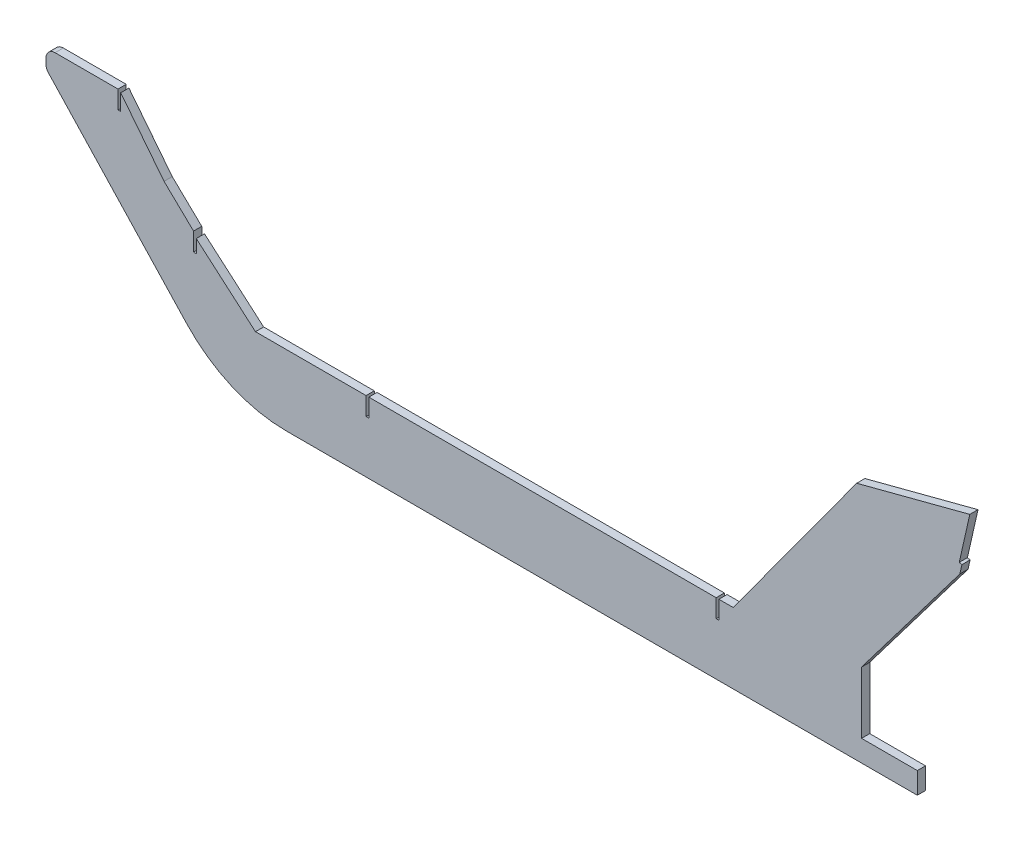
ISO-10303-21;
HEADER;
FILE_DESCRIPTION(('STEP AP214'),'2;1');
FILE_NAME('part.step','',(''),(''),'','','');
FILE_SCHEMA(('AUTOMOTIVE_DESIGN { 1 0 10303 214 1 1 1 1 }'));
ENDSEC;
DATA;
#1=APPLICATION_CONTEXT('core data for automotive mechanical design processes');
#2=APPLICATION_PROTOCOL_DEFINITION('international standard','automotive_design',2000,#1);
#3=PRODUCT_CONTEXT('',#1,'mechanical');
#4=PRODUCT('Part','Part','',(#3));
#5=PRODUCT_RELATED_PRODUCT_CATEGORY('part','',(#4));
#6=PRODUCT_DEFINITION_FORMATION('','',#4);
#7=PRODUCT_DEFINITION_CONTEXT('part definition',#1,'design');
#8=PRODUCT_DEFINITION('design','',#6,#7);
#9=PRODUCT_DEFINITION_SHAPE('','',#8);
#10=(LENGTH_UNIT() NAMED_UNIT(*) SI_UNIT(.MILLI.,.METRE.));
#11=(NAMED_UNIT(*) PLANE_ANGLE_UNIT() SI_UNIT($,.RADIAN.));
#12=(NAMED_UNIT(*) SI_UNIT($,.STERADIAN.) SOLID_ANGLE_UNIT());
#13=UNCERTAINTY_MEASURE_WITH_UNIT(LENGTH_MEASURE(1.E-05),#10,'distance_accuracy_value','');
#14=(GEOMETRIC_REPRESENTATION_CONTEXT(3) GLOBAL_UNCERTAINTY_ASSIGNED_CONTEXT((#13)) GLOBAL_UNIT_ASSIGNED_CONTEXT((#10,
#11,#12)) REPRESENTATION_CONTEXT('',''));
#15=CARTESIAN_POINT('',(0.,0.,0.));
#16=DIRECTION('',(0.,0.,1.));
#17=DIRECTION('',(1.,0.,0.));
#18=AXIS2_PLACEMENT_3D('',#15,#16,#17);
#19=CARTESIAN_POINT('',(0.,23.5441952155164,-4.5));
#20=DIRECTION('',(1.,0.,0.));
#21=DIRECTION('',(0.,0.,-1.));
#22=AXIS2_PLACEMENT_3D('',#19,#20,#21);
#23=PLANE('',#22);
#24=DIRECTION('',(0.,0.,1.));
#25=VECTOR('',#24,1.);
#26=CARTESIAN_POINT('',(0.,23.5441952155164,-4.5));
#27=LINE('',#26,#25);
#28=CARTESIAN_POINT('',(0.,23.5441952155164,-4.5));
#29=VERTEX_POINT('',#28);
#30=CARTESIAN_POINT('',(0.,23.5441952155164,4.5));
#31=VERTEX_POINT('',#30);
#32=EDGE_CURVE('E262',#29,#31,#27,.T.);
#33=ORIENTED_EDGE('',*,*,#32,.T.);
#34=DIRECTION('',(0.,1.,0.));
#35=VECTOR('',#34,1.);
#36=CARTESIAN_POINT('',(0.,23.5441952155164,4.5));
#37=LINE('',#36,#35);
#38=CARTESIAN_POINT('',(0.,0.,4.5));
#39=VERTEX_POINT('',#38);
#40=EDGE_CURVE('E266',#39,#31,#37,.T.);
#41=ORIENTED_EDGE('',*,*,#40,.F.);
#42=DIRECTION('',(0.,0.,1.));
#43=VECTOR('',#42,1.);
#44=CARTESIAN_POINT('',(0.,0.,-4.5));
#45=LINE('',#44,#43);
#46=CARTESIAN_POINT('',(0.,0.,-4.5));
#47=VERTEX_POINT('',#46);
#48=EDGE_CURVE('E457',#47,#39,#45,.T.);
#49=ORIENTED_EDGE('',*,*,#48,.F.);
#50=DIRECTION('',(0.,1.,0.));
#51=VECTOR('',#50,1.);
#52=CARTESIAN_POINT('',(0.,23.5441952155164,-4.5));
#53=LINE('',#52,#51);
#54=EDGE_CURVE('E268',#47,#29,#53,.T.);
#55=ORIENTED_EDGE('',*,*,#54,.T.);
#56=EDGE_LOOP('',(#33,#41,#49,#55));
#57=FACE_BOUND('',#56,.T.);
#58=ADVANCED_FACE('F41',(#57),#23,.T.);
#59=CARTESIAN_POINT('',(0.,0.,-4.5));
#60=DIRECTION('',(0.,-1.,0.));
#61=DIRECTION('',(1.,0.,0.));
#62=AXIS2_PLACEMENT_3D('',#59,#60,#61);
#63=PLANE('',#62);
#64=DIRECTION('',(1.,0.,0.));
#65=VECTOR('',#64,1.);
#66=CARTESIAN_POINT('',(0.,0.,4.5));
#67=LINE('',#66,#65);
#68=CARTESIAN_POINT('',(-693.621415605386,0.,4.5));
#69=VERTEX_POINT('',#68);
#70=EDGE_CURVE('E286',#69,#39,#67,.T.);
#71=ORIENTED_EDGE('',*,*,#70,.F.);
#72=DIRECTION('',(0.,0.,1.));
#73=VECTOR('',#72,1.);
#74=CARTESIAN_POINT('',(-693.621415605386,0.,-4.5));
#75=LINE('',#74,#73);
#76=CARTESIAN_POINT('',(-693.621415605386,0.,-4.5));
#77=VERTEX_POINT('',#76);
#78=EDGE_CURVE('E515',#69,#77,#75,.F.);
#79=ORIENTED_EDGE('',*,*,#78,.T.);
#80=DIRECTION('',(1.,0.,0.));
#81=VECTOR('',#80,1.);
#82=CARTESIAN_POINT('',(0.,0.,-4.5));
#83=LINE('',#82,#81);
#84=EDGE_CURVE('E273',#77,#47,#83,.T.);
#85=ORIENTED_EDGE('',*,*,#84,.T.);
#86=ORIENTED_EDGE('',*,*,#48,.T.);
#87=EDGE_LOOP('',(#71,#79,#85,#86));
#88=FACE_BOUND('',#87,.T.);
#89=ADVANCED_FACE('F556',(#88),#63,.T.);
#90=CARTESIAN_POINT('',(-758.779695033301,0.,-4.5));
#91=DIRECTION('',(-0.73086723876955,-0.682519654876967,0.));
#92=DIRECTION('',(0.682519654876967,-0.73086723876955,0.));
#93=AXIS2_PLACEMENT_3D('',#90,#91,#92);
#94=PLANE('',#93);
#95=DIRECTION('',(0.682519654876967,-0.73086723876955,0.));
#96=VECTOR('',#95,1.);
#97=CARTESIAN_POINT('',(-758.779695033301,0.,4.5));
#98=LINE('',#97,#96);
#99=CARTESIAN_POINT('',(-954.987449898675,210.106506089526,4.5));
#100=VERTEX_POINT('',#99);
#101=CARTESIAN_POINT('',(-803.251501420818,47.6220517684549,4.5));
#102=VERTEX_POINT('',#101);
#103=EDGE_CURVE('E368',#100,#102,#98,.T.);
#104=ORIENTED_EDGE('',*,*,#103,.F.);
#105=DIRECTION('',(0.,0.,1.));
#106=VECTOR('',#105,1.);
#107=CARTESIAN_POINT('',(-954.987449898675,210.106506089526,-4.5));
#108=LINE('',#107,#106);
#109=CARTESIAN_POINT('',(-954.987449898675,210.106506089526,-4.5));
#110=VERTEX_POINT('',#109);
#111=EDGE_CURVE('E11',#100,#110,#108,.F.);
#112=ORIENTED_EDGE('',*,*,#111,.T.);
#113=DIRECTION('',(0.682519654876967,-0.73086723876955,0.));
#114=VECTOR('',#113,1.);
#115=CARTESIAN_POINT('',(-758.779695033301,0.,-4.5));
#116=LINE('',#115,#114);
#117=CARTESIAN_POINT('',(-803.251501420818,47.6220517684549,-4.5));
#118=VERTEX_POINT('',#117);
#119=EDGE_CURVE('E454',#110,#118,#116,.T.);
#120=ORIENTED_EDGE('',*,*,#119,.T.);
#121=DIRECTION('',(0.,0.,1.));
#122=VECTOR('',#121,1.);
#123=CARTESIAN_POINT('',(-803.251501420818,47.6220517684549,-4.5));
#124=LINE('',#123,#122);
#125=EDGE_CURVE('E459',#118,#102,#124,.T.);
#126=ORIENTED_EDGE('',*,*,#125,.T.);
#127=EDGE_LOOP('',(#104,#112,#120,#126));
#128=FACE_BOUND('',#127,.T.);
#129=ADVANCED_FACE('F549',(#128),#94,.T.);
#130=CARTESIAN_POINT('',(-957.67877751098,212.988479035761,-4.5));
#131=DIRECTION('',(-1.,0.,0.));
#132=DIRECTION('',(0.,0.,1.));
#133=AXIS2_PLACEMENT_3D('',#130,#131,#132);
#134=PLANE('',#133);
#135=DIRECTION('',(0.,-1.,0.));
#136=VECTOR('',#135,1.);
#137=CARTESIAN_POINT('',(-957.67877751098,212.988479035761,4.5));
#138=LINE('',#137,#136);
#139=CARTESIAN_POINT('',(-957.67877751098,222.988479035761,4.5));
#140=VERTEX_POINT('',#139);
#141=CARTESIAN_POINT('',(-957.67877751098,216.931702638296,4.5));
#142=VERTEX_POINT('',#141);
#143=EDGE_CURVE('E365',#140,#142,#138,.T.);
#144=ORIENTED_EDGE('',*,*,#143,.F.);
#145=DIRECTION('',(0.,0.,1.));
#146=VECTOR('',#145,1.);
#147=CARTESIAN_POINT('',(-957.67877751098,222.988479035761,-4.5));
#148=LINE('',#147,#146);
#149=CARTESIAN_POINT('',(-957.67877751098,222.988479035761,-4.5));
#150=VERTEX_POINT('',#149);
#151=EDGE_CURVE('E530',#140,#150,#148,.F.);
#152=ORIENTED_EDGE('',*,*,#151,.T.);
#153=DIRECTION('',(0.,-1.,0.));
#154=VECTOR('',#153,1.);
#155=CARTESIAN_POINT('',(-957.67877751098,212.988479035761,-4.5));
#156=LINE('',#155,#154);
#157=CARTESIAN_POINT('',(-957.67877751098,216.931702638296,-4.5));
#158=VERTEX_POINT('',#157);
#159=EDGE_CURVE('E452',#150,#158,#156,.T.);
#160=ORIENTED_EDGE('',*,*,#159,.T.);
#161=DIRECTION('',(0.,0.,1.));
#162=VECTOR('',#161,1.);
#163=CARTESIAN_POINT('',(-957.67877751098,216.931702638296,-4.5));
#164=LINE('',#163,#162);
#165=EDGE_CURVE('E527',#158,#142,#164,.T.);
#166=ORIENTED_EDGE('',*,*,#165,.T.);
#167=EDGE_LOOP('',(#144,#152,#160,#166));
#168=FACE_BOUND('',#167,.T.);
#169=ADVANCED_FACE('F545',(#168),#134,.T.);
#170=CARTESIAN_POINT('',(-957.67877751098,232.988479035761,-4.5));
#171=DIRECTION('',(0.,1.,0.));
#172=DIRECTION('',(0.,0.,1.));
#173=AXIS2_PLACEMENT_3D('',#170,#171,#172);
#174=PLANE('',#173);
#175=DIRECTION('',(-1.,0.,0.));
#176=VECTOR('',#175,1.);
#177=CARTESIAN_POINT('',(-957.67877751098,232.988479035761,-4.5));
#178=LINE('',#177,#176);
#179=CARTESIAN_POINT('',(-878.536330397254,232.988479035761,-4.5));
#180=VERTEX_POINT('',#179);
#181=CARTESIAN_POINT('',(-947.67877751098,232.988479035761,-4.5));
#182=VERTEX_POINT('',#181);
#183=EDGE_CURVE('E449',#180,#182,#178,.T.);
#184=ORIENTED_EDGE('',*,*,#183,.T.);
#185=DIRECTION('',(0.,0.,1.));
#186=VECTOR('',#185,1.);
#187=CARTESIAN_POINT('',(-947.67877751098,232.988479035761,-4.5));
#188=LINE('',#187,#186);
#189=CARTESIAN_POINT('',(-947.67877751098,232.988479035761,4.5));
#190=VERTEX_POINT('',#189);
#191=EDGE_CURVE('E520',#182,#190,#188,.T.);
#192=ORIENTED_EDGE('',*,*,#191,.T.);
#193=DIRECTION('',(-1.,0.,0.));
#194=VECTOR('',#193,1.);
#195=CARTESIAN_POINT('',(-957.67877751098,232.988479035761,4.5));
#196=LINE('',#195,#194);
#197=CARTESIAN_POINT('',(-878.536330397254,232.988479035761,4.5));
#198=VERTEX_POINT('',#197);
#199=EDGE_CURVE('E363',#198,#190,#196,.T.);
#200=ORIENTED_EDGE('',*,*,#199,.F.);
#201=DIRECTION('',(0.,0.,1.));
#202=VECTOR('',#201,1.);
#203=CARTESIAN_POINT('',(-878.536330397254,232.988479035761,-4.5));
#204=LINE('',#203,#202);
#205=EDGE_CURVE('E460',#180,#198,#204,.T.);
#206=ORIENTED_EDGE('',*,*,#205,.F.);
#207=EDGE_LOOP('',(#184,#192,#200,#206));
#208=FACE_BOUND('',#207,.T.);
#209=ADVANCED_FACE('F540',(#208),#174,.T.);
#210=CARTESIAN_POINT('',(-878.536330397254,232.988479035761,-4.5));
#211=DIRECTION('',(1.,0.,0.));
#212=DIRECTION('',(0.,0.,-1.));
#213=AXIS2_PLACEMENT_3D('',#210,#211,#212);
#214=PLANE('',#213);
#215=ORIENTED_EDGE('',*,*,#205,.T.);
#216=DIRECTION('',(0.,1.,0.));
#217=VECTOR('',#216,1.);
#218=CARTESIAN_POINT('',(-878.536330397254,232.988479035761,4.5));
#219=LINE('',#218,#217);
#220=CARTESIAN_POINT('',(-878.536330397254,212.988479035761,4.5));
#221=VERTEX_POINT('',#220);
#222=EDGE_CURVE('E360',#221,#198,#219,.T.);
#223=ORIENTED_EDGE('',*,*,#222,.F.);
#224=DIRECTION('',(0.,0.,1.));
#225=VECTOR('',#224,1.);
#226=CARTESIAN_POINT('',(-878.536330397254,212.988479035761,-4.5));
#227=LINE('',#226,#225);
#228=CARTESIAN_POINT('',(-878.536330397254,212.988479035761,-4.5));
#229=VERTEX_POINT('',#228);
#230=EDGE_CURVE('E462',#229,#221,#227,.T.);
#231=ORIENTED_EDGE('',*,*,#230,.F.);
#232=DIRECTION('',(0.,1.,0.));
#233=VECTOR('',#232,1.);
#234=CARTESIAN_POINT('',(-878.536330397254,232.988479035761,-4.5));
#235=LINE('',#234,#233);
#236=EDGE_CURVE('E446',#229,#180,#235,.T.);
#237=ORIENTED_EDGE('',*,*,#236,.T.);
#238=EDGE_LOOP('',(#215,#223,#231,#237));
#239=FACE_BOUND('',#238,.T.);
#240=ADVANCED_FACE('F654',(#239),#214,.T.);
#241=CARTESIAN_POINT('',(-878.536330397254,212.988479035761,-4.5));
#242=DIRECTION('',(0.,1.,0.));
#243=DIRECTION('',(0.,0.,1.));
#244=AXIS2_PLACEMENT_3D('',#241,#242,#243);
#245=PLANE('',#244);
#246=ORIENTED_EDGE('',*,*,#230,.T.);
#247=DIRECTION('',(-1.,0.,0.));
#248=VECTOR('',#247,1.);
#249=CARTESIAN_POINT('',(-878.536330397254,212.988479035761,4.5));
#250=LINE('',#249,#248);
#251=CARTESIAN_POINT('',(-875.536330397254,212.988479035761,4.5));
#252=VERTEX_POINT('',#251);
#253=EDGE_CURVE('E357',#252,#221,#250,.T.);
#254=ORIENTED_EDGE('',*,*,#253,.F.);
#255=DIRECTION('',(0.,0.,1.));
#256=VECTOR('',#255,1.);
#257=CARTESIAN_POINT('',(-875.536330397254,212.988479035761,-4.5));
#258=LINE('',#257,#256);
#259=CARTESIAN_POINT('',(-875.536330397254,212.988479035761,-4.5));
#260=VERTEX_POINT('',#259);
#261=EDGE_CURVE('E464',#260,#252,#258,.T.);
#262=ORIENTED_EDGE('',*,*,#261,.F.);
#263=DIRECTION('',(-1.,0.,0.));
#264=VECTOR('',#263,1.);
#265=CARTESIAN_POINT('',(-878.536330397254,212.988479035761,-4.5));
#266=LINE('',#265,#264);
#267=EDGE_CURVE('E443',#260,#229,#266,.T.);
#268=ORIENTED_EDGE('',*,*,#267,.T.);
#269=EDGE_LOOP('',(#246,#254,#262,#268));
#270=FACE_BOUND('',#269,.T.);
#271=ADVANCED_FACE('F652',(#270),#245,.T.);
#272=CARTESIAN_POINT('',(-875.536330397254,212.988479035761,-4.5));
#273=DIRECTION('',(-1.,0.,0.));
#274=DIRECTION('',(0.,0.,1.));
#275=AXIS2_PLACEMENT_3D('',#272,#273,#274);
#276=PLANE('',#275);
#277=ORIENTED_EDGE('',*,*,#261,.T.);
#278=DIRECTION('',(0.,-1.,0.));
#279=VECTOR('',#278,1.);
#280=CARTESIAN_POINT('',(-875.536330397254,212.988479035761,4.5));
#281=LINE('',#280,#279);
#282=CARTESIAN_POINT('',(-875.536330397254,230.940110876433,4.5));
#283=VERTEX_POINT('',#282);
#284=EDGE_CURVE('E354',#283,#252,#281,.T.);
#285=ORIENTED_EDGE('',*,*,#284,.F.);
#286=DIRECTION('',(0.,0.,1.));
#287=VECTOR('',#286,1.);
#288=CARTESIAN_POINT('',(-875.536330397254,230.940110876433,-4.5));
#289=LINE('',#288,#287);
#290=CARTESIAN_POINT('',(-875.536330397254,230.940110876433,-4.5));
#291=VERTEX_POINT('',#290);
#292=EDGE_CURVE('E466',#291,#283,#289,.T.);
#293=ORIENTED_EDGE('',*,*,#292,.F.);
#294=DIRECTION('',(0.,-1.,0.));
#295=VECTOR('',#294,1.);
#296=CARTESIAN_POINT('',(-875.536330397254,212.988479035761,-4.5));
#297=LINE('',#296,#295);
#298=EDGE_CURVE('E440',#291,#260,#297,.T.);
#299=ORIENTED_EDGE('',*,*,#298,.T.);
#300=EDGE_LOOP('',(#277,#285,#293,#299));
#301=FACE_BOUND('',#300,.T.);
#302=ADVANCED_FACE('F650',(#301),#276,.T.);
#303=CARTESIAN_POINT('',(-875.536330397254,230.940110876433,-4.5));
#304=DIRECTION('',(0.785943303801176,0.618298571250244,0.));
#305=DIRECTION('',(-0.618298571250244,0.785943303801176,0.));
#306=AXIS2_PLACEMENT_3D('',#303,#304,#305);
#307=PLANE('',#306);
#308=ORIENTED_EDGE('',*,*,#292,.T.);
#309=DIRECTION('',(-0.618298571250244,0.785943303801176,0.));
#310=VECTOR('',#309,1.);
#311=CARTESIAN_POINT('',(-875.536330397254,230.940110876433,4.5));
#312=LINE('',#311,#310);
#313=CARTESIAN_POINT('',(-827.92820437735,170.423574704911,4.5));
#314=VERTEX_POINT('',#313);
#315=EDGE_CURVE('E351',#314,#283,#312,.T.);
#316=ORIENTED_EDGE('',*,*,#315,.F.);
#317=DIRECTION('',(0.,0.,1.));
#318=VECTOR('',#317,1.);
#319=CARTESIAN_POINT('',(-827.92820437735,170.423574704911,-4.5));
#320=LINE('',#319,#318);
#321=CARTESIAN_POINT('',(-827.92820437735,170.423574704911,-4.5));
#322=VERTEX_POINT('',#321);
#323=EDGE_CURVE('E468',#322,#314,#320,.T.);
#324=ORIENTED_EDGE('',*,*,#323,.F.);
#325=DIRECTION('',(-0.618298571250244,0.785943303801176,0.));
#326=VECTOR('',#325,1.);
#327=CARTESIAN_POINT('',(-875.536330397254,230.940110876433,-4.5));
#328=LINE('',#327,#326);
#329=EDGE_CURVE('E437',#322,#291,#328,.T.);
#330=ORIENTED_EDGE('',*,*,#329,.T.);
#331=EDGE_LOOP('',(#308,#316,#324,#330));
#332=FACE_BOUND('',#331,.T.);
#333=ADVANCED_FACE('F645',(#332),#307,.T.);
#334=CARTESIAN_POINT('',(-827.92820437735,170.423574704911,-4.5));
#335=DIRECTION('',(0.692207582207109,0.721698457207017,0.));
#336=DIRECTION('',(-0.721698457207017,0.692207582207109,0.));
#337=AXIS2_PLACEMENT_3D('',#334,#335,#336);
#338=PLANE('',#337);
#339=ORIENTED_EDGE('',*,*,#323,.T.);
#340=DIRECTION('',(-0.721698457207017,0.692207582207109,0.));
#341=VECTOR('',#340,1.);
#342=CARTESIAN_POINT('',(-827.92820437735,170.423574704911,4.5));
#343=LINE('',#342,#341);
#344=CARTESIAN_POINT('',(-795.486560580996,139.307598786097,4.5));
#345=VERTEX_POINT('',#344);
#346=EDGE_CURVE('E348',#345,#314,#343,.T.);
#347=ORIENTED_EDGE('',*,*,#346,.F.);
#348=DIRECTION('',(0.,0.,1.));
#349=VECTOR('',#348,1.);
#350=CARTESIAN_POINT('',(-795.486560580996,139.307598786097,-4.5));
#351=LINE('',#350,#349);
#352=CARTESIAN_POINT('',(-795.486560580996,139.307598786097,-4.5));
#353=VERTEX_POINT('',#352);
#354=EDGE_CURVE('E470',#353,#345,#351,.T.);
#355=ORIENTED_EDGE('',*,*,#354,.F.);
#356=DIRECTION('',(-0.721698457207017,0.692207582207109,0.));
#357=VECTOR('',#356,1.);
#358=CARTESIAN_POINT('',(-827.92820437735,170.423574704911,-4.5));
#359=LINE('',#358,#357);
#360=EDGE_CURVE('E434',#353,#322,#359,.T.);
#361=ORIENTED_EDGE('',*,*,#360,.T.);
#362=EDGE_LOOP('',(#339,#347,#355,#361));
#363=FACE_BOUND('',#362,.T.);
#364=ADVANCED_FACE('F640',(#363),#338,.T.);
#365=CARTESIAN_POINT('',(-795.486560580996,139.307598786097,-4.5));
#366=DIRECTION('',(1.,0.,0.));
#367=DIRECTION('',(0.,0.,-1.));
#368=AXIS2_PLACEMENT_3D('',#365,#366,#367);
#369=PLANE('',#368);
#370=ORIENTED_EDGE('',*,*,#354,.T.);
#371=DIRECTION('',(0.,1.,0.));
#372=VECTOR('',#371,1.);
#373=CARTESIAN_POINT('',(-795.486560580996,139.307598786097,4.5));
#374=LINE('',#373,#372);
#375=CARTESIAN_POINT('',(-795.486560580996,119.307598786098,4.5));
#376=VERTEX_POINT('',#375);
#377=EDGE_CURVE('E345',#376,#345,#374,.T.);
#378=ORIENTED_EDGE('',*,*,#377,.F.);
#379=DIRECTION('',(0.,0.,1.));
#380=VECTOR('',#379,1.);
#381=CARTESIAN_POINT('',(-795.486560580996,119.307598786098,-4.5));
#382=LINE('',#381,#380);
#383=CARTESIAN_POINT('',(-795.486560580996,119.307598786098,-4.5));
#384=VERTEX_POINT('',#383);
#385=EDGE_CURVE('E472',#384,#376,#382,.T.);
#386=ORIENTED_EDGE('',*,*,#385,.F.);
#387=DIRECTION('',(0.,1.,0.));
#388=VECTOR('',#387,1.);
#389=CARTESIAN_POINT('',(-795.486560580996,139.307598786097,-4.5));
#390=LINE('',#389,#388);
#391=EDGE_CURVE('E431',#384,#353,#390,.T.);
#392=ORIENTED_EDGE('',*,*,#391,.T.);
#393=EDGE_LOOP('',(#370,#378,#386,#392));
#394=FACE_BOUND('',#393,.T.);
#395=ADVANCED_FACE('F638',(#394),#369,.T.);
#396=CARTESIAN_POINT('',(-795.486560580996,119.307598786098,-4.5));
#397=DIRECTION('',(0.,1.,0.));
#398=DIRECTION('',(0.,0.,1.));
#399=AXIS2_PLACEMENT_3D('',#396,#397,#398);
#400=PLANE('',#399);
#401=ORIENTED_EDGE('',*,*,#385,.T.);
#402=DIRECTION('',(-1.,0.,0.));
#403=VECTOR('',#402,1.);
#404=CARTESIAN_POINT('',(-795.486560580996,119.307598786098,4.5));
#405=LINE('',#404,#403);
#406=CARTESIAN_POINT('',(-792.486560580996,119.307598786098,4.5));
#407=VERTEX_POINT('',#406);
#408=EDGE_CURVE('E342',#407,#376,#405,.T.);
#409=ORIENTED_EDGE('',*,*,#408,.F.);
#410=DIRECTION('',(0.,0.,1.));
#411=VECTOR('',#410,1.);
#412=CARTESIAN_POINT('',(-792.486560580996,119.307598786098,-4.5));
#413=LINE('',#412,#411);
#414=CARTESIAN_POINT('',(-792.486560580996,119.307598786098,-4.5));
#415=VERTEX_POINT('',#414);
#416=EDGE_CURVE('E474',#415,#407,#413,.T.);
#417=ORIENTED_EDGE('',*,*,#416,.F.);
#418=DIRECTION('',(-1.,0.,0.));
#419=VECTOR('',#418,1.);
#420=CARTESIAN_POINT('',(-795.486560580996,119.307598786098,-4.5));
#421=LINE('',#420,#419);
#422=EDGE_CURVE('E428',#415,#384,#421,.T.);
#423=ORIENTED_EDGE('',*,*,#422,.T.);
#424=EDGE_LOOP('',(#401,#409,#417,#423));
#425=FACE_BOUND('',#424,.T.);
#426=ADVANCED_FACE('F633',(#425),#400,.T.);
#427=CARTESIAN_POINT('',(-792.486560580996,119.307598786098,-4.5));
#428=DIRECTION('',(-1.,0.,0.));
#429=DIRECTION('',(0.,0.,1.));
#430=AXIS2_PLACEMENT_3D('',#427,#428,#429);
#431=PLANE('',#430);
#432=ORIENTED_EDGE('',*,*,#416,.T.);
#433=DIRECTION('',(0.,-1.,0.));
#434=VECTOR('',#433,1.);
#435=CARTESIAN_POINT('',(-792.486560580996,119.307598786098,4.5));
#436=LINE('',#435,#434);
#437=CARTESIAN_POINT('',(-792.486560580996,133.699221333963,4.5));
#438=VERTEX_POINT('',#437);
#439=EDGE_CURVE('E339',#438,#407,#436,.T.);
#440=ORIENTED_EDGE('',*,*,#439,.F.);
#441=DIRECTION('',(0.,0.,1.));
#442=VECTOR('',#441,1.);
#443=CARTESIAN_POINT('',(-792.486560580996,133.699221333963,-4.5));
#444=LINE('',#443,#442);
#445=CARTESIAN_POINT('',(-792.486560580996,133.699221333963,-4.5));
#446=VERTEX_POINT('',#445);
#447=EDGE_CURVE('E476',#446,#438,#444,.T.);
#448=ORIENTED_EDGE('',*,*,#447,.F.);
#449=DIRECTION('',(0.,-1.,0.));
#450=VECTOR('',#449,1.);
#451=CARTESIAN_POINT('',(-792.486560580996,119.307598786098,-4.5));
#452=LINE('',#451,#450);
#453=EDGE_CURVE('E425',#446,#415,#452,.T.);
#454=ORIENTED_EDGE('',*,*,#453,.T.);
#455=EDGE_LOOP('',(#432,#440,#448,#454));
#456=FACE_BOUND('',#455,.T.);
#457=ADVANCED_FACE('F628',(#456),#431,.T.);
#458=CARTESIAN_POINT('',(-792.486560580996,133.699221333963,-4.5));
#459=DIRECTION('',(0.653632356666354,0.756812223949104,0.));
#460=DIRECTION('',(-0.756812223949104,0.653632356666354,0.));
#461=AXIS2_PLACEMENT_3D('',#458,#459,#460);
#462=PLANE('',#461);
#463=ORIENTED_EDGE('',*,*,#447,.T.);
#464=DIRECTION('',(-0.756812223949104,0.653632356666354,0.));
#465=VECTOR('',#464,1.);
#466=CARTESIAN_POINT('',(-792.486560580996,133.699221333963,4.5));
#467=LINE('',#466,#465);
#468=CARTESIAN_POINT('',(-727.464635298531,77.542049300469,4.5));
#469=VERTEX_POINT('',#468);
#470=EDGE_CURVE('E336',#469,#438,#467,.T.);
#471=ORIENTED_EDGE('',*,*,#470,.F.);
#472=DIRECTION('',(0.,0.,1.));
#473=VECTOR('',#472,1.);
#474=CARTESIAN_POINT('',(-727.464635298531,77.542049300469,-4.5));
#475=LINE('',#474,#473);
#476=CARTESIAN_POINT('',(-727.464635298531,77.542049300469,-4.5));
#477=VERTEX_POINT('',#476);
#478=EDGE_CURVE('E478',#477,#469,#475,.T.);
#479=ORIENTED_EDGE('',*,*,#478,.F.);
#480=DIRECTION('',(-0.756812223949104,0.653632356666354,0.));
#481=VECTOR('',#480,1.);
#482=CARTESIAN_POINT('',(-792.486560580996,133.699221333963,-4.5));
#483=LINE('',#482,#481);
#484=EDGE_CURVE('E422',#477,#446,#483,.T.);
#485=ORIENTED_EDGE('',*,*,#484,.T.);
#486=EDGE_LOOP('',(#463,#471,#479,#485));
#487=FACE_BOUND('',#486,.T.);
#488=ADVANCED_FACE('F626',(#487),#462,.T.);
#489=CARTESIAN_POINT('',(-727.464635298531,77.542049300469,-4.5));
#490=DIRECTION('',(0.,1.,0.));
#491=DIRECTION('',(0.,0.,1.));
#492=AXIS2_PLACEMENT_3D('',#489,#490,#491);
#493=PLANE('',#492);
#494=ORIENTED_EDGE('',*,*,#478,.T.);
#495=DIRECTION('',(-1.,0.,0.));
#496=VECTOR('',#495,1.);
#497=CARTESIAN_POINT('',(-727.464635298531,77.542049300469,4.5));
#498=LINE('',#497,#496);
#499=CARTESIAN_POINT('',(-605.872801012454,77.542049300469,4.5));
#500=VERTEX_POINT('',#499);
#501=EDGE_CURVE('E333',#500,#469,#498,.T.);
#502=ORIENTED_EDGE('',*,*,#501,.F.);
#503=DIRECTION('',(0.,0.,1.));
#504=VECTOR('',#503,1.);
#505=CARTESIAN_POINT('',(-605.872801012454,77.542049300469,-4.5));
#506=LINE('',#505,#504);
#507=CARTESIAN_POINT('',(-605.872801012454,77.542049300469,-4.5));
#508=VERTEX_POINT('',#507);
#509=EDGE_CURVE('E480',#508,#500,#506,.T.);
#510=ORIENTED_EDGE('',*,*,#509,.F.);
#511=DIRECTION('',(-1.,0.,0.));
#512=VECTOR('',#511,1.);
#513=CARTESIAN_POINT('',(-727.464635298531,77.542049300469,-4.5));
#514=LINE('',#513,#512);
#515=EDGE_CURVE('E419',#508,#477,#514,.T.);
#516=ORIENTED_EDGE('',*,*,#515,.T.);
#517=EDGE_LOOP('',(#494,#502,#510,#516));
#518=FACE_BOUND('',#517,.T.);
#519=ADVANCED_FACE('F621',(#518),#493,.T.);
#520=CARTESIAN_POINT('',(-605.872801012454,77.542049300469,-4.5));
#521=DIRECTION('',(1.,0.,0.));
#522=DIRECTION('',(0.,0.,-1.));
#523=AXIS2_PLACEMENT_3D('',#520,#521,#522);
#524=PLANE('',#523);
#525=ORIENTED_EDGE('',*,*,#509,.T.);
#526=DIRECTION('',(0.,1.,0.));
#527=VECTOR('',#526,1.);
#528=CARTESIAN_POINT('',(-605.872801012454,77.542049300469,4.5));
#529=LINE('',#528,#527);
#530=CARTESIAN_POINT('',(-605.872801012454,57.542049300469,4.5));
#531=VERTEX_POINT('',#530);
#532=EDGE_CURVE('E330',#531,#500,#529,.T.);
#533=ORIENTED_EDGE('',*,*,#532,.F.);
#534=DIRECTION('',(0.,0.,1.));
#535=VECTOR('',#534,1.);
#536=CARTESIAN_POINT('',(-605.872801012454,57.542049300469,-4.5));
#537=LINE('',#536,#535);
#538=CARTESIAN_POINT('',(-605.872801012454,57.542049300469,-4.5));
#539=VERTEX_POINT('',#538);
#540=EDGE_CURVE('E482',#539,#531,#537,.T.);
#541=ORIENTED_EDGE('',*,*,#540,.F.);
#542=DIRECTION('',(0.,1.,0.));
#543=VECTOR('',#542,1.);
#544=CARTESIAN_POINT('',(-605.872801012454,77.542049300469,-4.5));
#545=LINE('',#544,#543);
#546=EDGE_CURVE('E416',#539,#508,#545,.T.);
#547=ORIENTED_EDGE('',*,*,#546,.T.);
#548=EDGE_LOOP('',(#525,#533,#541,#547));
#549=FACE_BOUND('',#548,.T.);
#550=ADVANCED_FACE('F616',(#549),#524,.T.);
#551=CARTESIAN_POINT('',(-605.872801012454,57.542049300469,-4.5));
#552=DIRECTION('',(0.,1.,0.));
#553=DIRECTION('',(0.,0.,1.));
#554=AXIS2_PLACEMENT_3D('',#551,#552,#553);
#555=PLANE('',#554);
#556=ORIENTED_EDGE('',*,*,#540,.T.);
#557=DIRECTION('',(-1.,0.,0.));
#558=VECTOR('',#557,1.);
#559=CARTESIAN_POINT('',(-605.872801012454,57.542049300469,4.5));
#560=LINE('',#559,#558);
#561=CARTESIAN_POINT('',(-602.872801012454,57.542049300469,4.5));
#562=VERTEX_POINT('',#561);
#563=EDGE_CURVE('E327',#562,#531,#560,.T.);
#564=ORIENTED_EDGE('',*,*,#563,.F.);
#565=DIRECTION('',(0.,0.,1.));
#566=VECTOR('',#565,1.);
#567=CARTESIAN_POINT('',(-602.872801012454,57.542049300469,-4.5));
#568=LINE('',#567,#566);
#569=CARTESIAN_POINT('',(-602.872801012454,57.542049300469,-4.5));
#570=VERTEX_POINT('',#569);
#571=EDGE_CURVE('E484',#570,#562,#568,.T.);
#572=ORIENTED_EDGE('',*,*,#571,.F.);
#573=DIRECTION('',(-1.,0.,0.));
#574=VECTOR('',#573,1.);
#575=CARTESIAN_POINT('',(-605.872801012454,57.542049300469,-4.5));
#576=LINE('',#575,#574);
#577=EDGE_CURVE('E413',#570,#539,#576,.T.);
#578=ORIENTED_EDGE('',*,*,#577,.T.);
#579=EDGE_LOOP('',(#556,#564,#572,#578));
#580=FACE_BOUND('',#579,.T.);
#581=ADVANCED_FACE('F614',(#580),#555,.T.);
#582=CARTESIAN_POINT('',(-602.872801012454,57.542049300469,-4.5));
#583=DIRECTION('',(-1.,0.,0.));
#584=DIRECTION('',(0.,0.,1.));
#585=AXIS2_PLACEMENT_3D('',#582,#583,#584);
#586=PLANE('',#585);
#587=ORIENTED_EDGE('',*,*,#571,.T.);
#588=DIRECTION('',(0.,-1.,0.));
#589=VECTOR('',#588,1.);
#590=CARTESIAN_POINT('',(-602.872801012454,57.542049300469,4.5));
#591=LINE('',#590,#589);
#592=CARTESIAN_POINT('',(-602.872801012454,77.542049300469,4.5));
#593=VERTEX_POINT('',#592);
#594=EDGE_CURVE('E324',#593,#562,#591,.T.);
#595=ORIENTED_EDGE('',*,*,#594,.F.);
#596=DIRECTION('',(0.,0.,1.));
#597=VECTOR('',#596,1.);
#598=CARTESIAN_POINT('',(-602.872801012454,77.542049300469,-4.5));
#599=LINE('',#598,#597);
#600=CARTESIAN_POINT('',(-602.872801012454,77.542049300469,-4.5));
#601=VERTEX_POINT('',#600);
#602=EDGE_CURVE('E486',#601,#593,#599,.T.);
#603=ORIENTED_EDGE('',*,*,#602,.F.);
#604=DIRECTION('',(0.,-1.,0.));
#605=VECTOR('',#604,1.);
#606=CARTESIAN_POINT('',(-602.872801012454,57.542049300469,-4.5));
#607=LINE('',#606,#605);
#608=EDGE_CURVE('E410',#601,#570,#607,.T.);
#609=ORIENTED_EDGE('',*,*,#608,.T.);
#610=EDGE_LOOP('',(#587,#595,#603,#609));
#611=FACE_BOUND('',#610,.T.);
#612=ADVANCED_FACE('F609',(#611),#586,.T.);
#613=CARTESIAN_POINT('',(-602.872801012454,77.542049300469,-4.5));
#614=DIRECTION('',(0.,1.,0.));
#615=DIRECTION('',(0.,0.,1.));
#616=AXIS2_PLACEMENT_3D('',#613,#614,#615);
#617=PLANE('',#616);
#618=ORIENTED_EDGE('',*,*,#602,.T.);
#619=DIRECTION('',(-1.,0.,0.));
#620=VECTOR('',#619,1.);
#621=CARTESIAN_POINT('',(-602.872801012454,77.542049300469,4.5));
#622=LINE('',#621,#620);
#623=CARTESIAN_POINT('',(-221.085552100639,77.542049300469,4.5));
#624=VERTEX_POINT('',#623);
#625=EDGE_CURVE('E321',#624,#593,#622,.T.);
#626=ORIENTED_EDGE('',*,*,#625,.F.);
#627=DIRECTION('',(0.,0.,1.));
#628=VECTOR('',#627,1.);
#629=CARTESIAN_POINT('',(-221.085552100639,77.542049300469,-4.5));
#630=LINE('',#629,#628);
#631=CARTESIAN_POINT('',(-221.085552100639,77.542049300469,-4.5));
#632=VERTEX_POINT('',#631);
#633=EDGE_CURVE('E488',#632,#624,#630,.T.);
#634=ORIENTED_EDGE('',*,*,#633,.F.);
#635=DIRECTION('',(-1.,0.,0.));
#636=VECTOR('',#635,1.);
#637=CARTESIAN_POINT('',(-602.872801012454,77.542049300469,-4.5));
#638=LINE('',#637,#636);
#639=EDGE_CURVE('E407',#632,#601,#638,.T.);
#640=ORIENTED_EDGE('',*,*,#639,.T.);
#641=EDGE_LOOP('',(#618,#626,#634,#640));
#642=FACE_BOUND('',#641,.T.);
#643=ADVANCED_FACE('F604',(#642),#617,.T.);
#644=CARTESIAN_POINT('',(-221.085552100639,77.542049300469,-4.5));
#645=DIRECTION('',(1.,0.,0.));
#646=DIRECTION('',(0.,1.,0.));
#647=AXIS2_PLACEMENT_3D('',#644,#645,#646);
#648=PLANE('',#647);
#649=ORIENTED_EDGE('',*,*,#633,.T.);
#650=DIRECTION('',(0.,1.,0.));
#651=VECTOR('',#650,1.);
#652=CARTESIAN_POINT('',(-221.085552100639,77.542049300469,4.5));
#653=LINE('',#652,#651);
#654=CARTESIAN_POINT('',(-221.085552100638,57.542049300469,4.5));
#655=VERTEX_POINT('',#654);
#656=EDGE_CURVE('E318',#655,#624,#653,.T.);
#657=ORIENTED_EDGE('',*,*,#656,.F.);
#658=DIRECTION('',(0.,0.,1.));
#659=VECTOR('',#658,1.);
#660=CARTESIAN_POINT('',(-221.085552100638,57.542049300469,-4.5));
#661=LINE('',#660,#659);
#662=CARTESIAN_POINT('',(-221.085552100638,57.542049300469,-4.5));
#663=VERTEX_POINT('',#662);
#664=EDGE_CURVE('E490',#663,#655,#661,.T.);
#665=ORIENTED_EDGE('',*,*,#664,.F.);
#666=DIRECTION('',(0.,1.,0.));
#667=VECTOR('',#666,1.);
#668=CARTESIAN_POINT('',(-221.085552100639,77.542049300469,-4.5));
#669=LINE('',#668,#667);
#670=EDGE_CURVE('E404',#663,#632,#669,.T.);
#671=ORIENTED_EDGE('',*,*,#670,.T.);
#672=EDGE_LOOP('',(#649,#657,#665,#671));
#673=FACE_BOUND('',#672,.T.);
#674=ADVANCED_FACE('F602',(#673),#648,.T.);
#675=CARTESIAN_POINT('',(-221.085552100638,57.542049300469,-4.5));
#676=DIRECTION('',(0.,1.,0.));
#677=DIRECTION('',(0.,0.,1.));
#678=AXIS2_PLACEMENT_3D('',#675,#676,#677);
#679=PLANE('',#678);
#680=ORIENTED_EDGE('',*,*,#664,.T.);
#681=DIRECTION('',(-1.,0.,0.));
#682=VECTOR('',#681,1.);
#683=CARTESIAN_POINT('',(-221.085552100638,57.542049300469,4.5));
#684=LINE('',#683,#682);
#685=CARTESIAN_POINT('',(-218.085552100639,57.542049300469,4.5));
#686=VERTEX_POINT('',#685);
#687=EDGE_CURVE('E315',#686,#655,#684,.T.);
#688=ORIENTED_EDGE('',*,*,#687,.F.);
#689=DIRECTION('',(0.,0.,1.));
#690=VECTOR('',#689,1.);
#691=CARTESIAN_POINT('',(-218.085552100639,57.542049300469,-4.5));
#692=LINE('',#691,#690);
#693=CARTESIAN_POINT('',(-218.085552100639,57.542049300469,-4.5));
#694=VERTEX_POINT('',#693);
#695=EDGE_CURVE('E492',#694,#686,#692,.T.);
#696=ORIENTED_EDGE('',*,*,#695,.F.);
#697=DIRECTION('',(-1.,0.,0.));
#698=VECTOR('',#697,1.);
#699=CARTESIAN_POINT('',(-221.085552100638,57.542049300469,-4.5));
#700=LINE('',#699,#698);
#701=EDGE_CURVE('E401',#694,#663,#700,.T.);
#702=ORIENTED_EDGE('',*,*,#701,.T.);
#703=EDGE_LOOP('',(#680,#688,#696,#702));
#704=FACE_BOUND('',#703,.T.);
#705=ADVANCED_FACE('F597',(#704),#679,.T.);
#706=CARTESIAN_POINT('',(-218.085552100639,57.542049300469,-4.5));
#707=DIRECTION('',(-1.,0.,0.));
#708=DIRECTION('',(0.,0.,1.));
#709=AXIS2_PLACEMENT_3D('',#706,#707,#708);
#710=PLANE('',#709);
#711=ORIENTED_EDGE('',*,*,#695,.T.);
#712=DIRECTION('',(0.,-1.,0.));
#713=VECTOR('',#712,1.);
#714=CARTESIAN_POINT('',(-218.085552100639,57.542049300469,4.5));
#715=LINE('',#714,#713);
#716=CARTESIAN_POINT('',(-218.085552100639,77.5420493004691,4.5));
#717=VERTEX_POINT('',#716);
#718=EDGE_CURVE('E312',#717,#686,#715,.T.);
#719=ORIENTED_EDGE('',*,*,#718,.F.);
#720=DIRECTION('',(0.,0.,1.));
#721=VECTOR('',#720,1.);
#722=CARTESIAN_POINT('',(-218.085552100639,77.5420493004691,-4.5));
#723=LINE('',#722,#721);
#724=CARTESIAN_POINT('',(-218.085552100639,77.5420493004691,-4.5));
#725=VERTEX_POINT('',#724);
#726=EDGE_CURVE('E494',#725,#717,#723,.T.);
#727=ORIENTED_EDGE('',*,*,#726,.F.);
#728=DIRECTION('',(0.,-1.,0.));
#729=VECTOR('',#728,1.);
#730=CARTESIAN_POINT('',(-218.085552100639,57.542049300469,-4.5));
#731=LINE('',#730,#729);
#732=EDGE_CURVE('E398',#725,#694,#731,.T.);
#733=ORIENTED_EDGE('',*,*,#732,.T.);
#734=EDGE_LOOP('',(#711,#719,#727,#733));
#735=FACE_BOUND('',#734,.T.);
#736=ADVANCED_FACE('F592',(#735),#710,.T.);
#737=CARTESIAN_POINT('',(-218.085552100639,77.5420493004691,-4.5));
#738=DIRECTION('',(0.,1.,0.));
#739=DIRECTION('',(0.,0.,1.));
#740=AXIS2_PLACEMENT_3D('',#737,#738,#739);
#741=PLANE('',#740);
#742=ORIENTED_EDGE('',*,*,#726,.T.);
#743=DIRECTION('',(-1.,0.,0.));
#744=VECTOR('',#743,1.);
#745=CARTESIAN_POINT('',(-218.085552100639,77.5420493004691,4.5));
#746=LINE('',#745,#744);
#747=CARTESIAN_POINT('',(-202.364770710492,77.5420493004691,4.5));
#748=VERTEX_POINT('',#747);
#749=EDGE_CURVE('E309',#748,#717,#746,.T.);
#750=ORIENTED_EDGE('',*,*,#749,.F.);
#751=DIRECTION('',(0.,0.,1.));
#752=VECTOR('',#751,1.);
#753=CARTESIAN_POINT('',(-202.364770710492,77.5420493004691,-4.5));
#754=LINE('',#753,#752);
#755=CARTESIAN_POINT('',(-202.364770710492,77.5420493004691,-4.5));
#756=VERTEX_POINT('',#755);
#757=EDGE_CURVE('E496',#756,#748,#754,.T.);
#758=ORIENTED_EDGE('',*,*,#757,.F.);
#759=DIRECTION('',(-1.,0.,0.));
#760=VECTOR('',#759,1.);
#761=CARTESIAN_POINT('',(-218.085552100639,77.5420493004691,-4.5));
#762=LINE('',#761,#760);
#763=EDGE_CURVE('E395',#756,#725,#762,.T.);
#764=ORIENTED_EDGE('',*,*,#763,.T.);
#765=EDGE_LOOP('',(#742,#750,#758,#764));
#766=FACE_BOUND('',#765,.T.);
#767=ADVANCED_FACE('F590',(#766),#741,.T.);
#768=CARTESIAN_POINT('',(-202.364770710492,77.5420493004691,-4.5));
#769=DIRECTION('',(-0.808018255074538,0.589157448791322,0.));
#770=DIRECTION('',(-0.589157448791322,-0.808018255074538,0.));
#771=AXIS2_PLACEMENT_3D('',#768,#769,#770);
#772=PLANE('',#771);
#773=ORIENTED_EDGE('',*,*,#757,.T.);
#774=DIRECTION('',(-0.589157448791322,-0.808018255074537,0.));
#775=VECTOR('',#774,1.);
#776=CARTESIAN_POINT('',(-202.364770710492,77.5420493004691,4.5));
#777=LINE('',#776,#775);
#778=CARTESIAN_POINT('',(-66.6266846981009,263.704257097213,4.5));
#779=VERTEX_POINT('',#778);
#780=EDGE_CURVE('E306',#779,#748,#777,.T.);
#781=ORIENTED_EDGE('',*,*,#780,.F.);
#782=DIRECTION('',(0.,0.,1.));
#783=VECTOR('',#782,1.);
#784=CARTESIAN_POINT('',(-66.6266846981009,263.704257097213,-4.5));
#785=LINE('',#784,#783);
#786=CARTESIAN_POINT('',(-66.6266846981009,263.704257097213,-4.5));
#787=VERTEX_POINT('',#786);
#788=EDGE_CURVE('E498',#787,#779,#785,.T.);
#789=ORIENTED_EDGE('',*,*,#788,.F.);
#790=DIRECTION('',(-0.589157448791322,-0.808018255074537,0.));
#791=VECTOR('',#790,1.);
#792=CARTESIAN_POINT('',(-202.364770710492,77.5420493004691,-4.5));
#793=LINE('',#792,#791);
#794=EDGE_CURVE('E392',#787,#756,#793,.T.);
#795=ORIENTED_EDGE('',*,*,#794,.T.);
#796=EDGE_LOOP('',(#773,#781,#789,#795));
#797=FACE_BOUND('',#796,.T.);
#798=ADVANCED_FACE('F585',(#797),#772,.T.);
#799=CARTESIAN_POINT('',(-66.6266846981009,263.704257097213,-4.5));
#800=DIRECTION('',(-0.253120952136189,0.967434640474316,0.));
#801=DIRECTION('',(-0.967434640474316,-0.253120952136189,0.));
#802=AXIS2_PLACEMENT_3D('',#799,#800,#801);
#803=PLANE('',#802);
#804=ORIENTED_EDGE('',*,*,#788,.T.);
#805=DIRECTION('',(-0.967434640474316,-0.253120952136189,0.));
#806=VECTOR('',#805,1.);
#807=CARTESIAN_POINT('',(-66.6266846981009,263.704257097213,4.5));
#808=LINE('',#807,#806);
#809=CARTESIAN_POINT('',(57.7090398668231,296.235629935989,4.5));
#810=VERTEX_POINT('',#809);
#811=EDGE_CURVE('E303',#810,#779,#808,.T.);
#812=ORIENTED_EDGE('',*,*,#811,.F.);
#813=DIRECTION('',(0.,0.,1.));
#814=VECTOR('',#813,1.);
#815=CARTESIAN_POINT('',(57.7090398668231,296.235629935989,-4.5));
#816=LINE('',#815,#814);
#817=CARTESIAN_POINT('',(57.7090398668231,296.235629935989,-4.5));
#818=VERTEX_POINT('',#817);
#819=EDGE_CURVE('E500',#818,#810,#816,.T.);
#820=ORIENTED_EDGE('',*,*,#819,.F.);
#821=DIRECTION('',(-0.967434640474316,-0.253120952136189,0.));
#822=VECTOR('',#821,1.);
#823=CARTESIAN_POINT('',(-66.6266846981009,263.704257097213,-4.5));
#824=LINE('',#823,#822);
#825=EDGE_CURVE('E389',#818,#787,#824,.T.);
#826=ORIENTED_EDGE('',*,*,#825,.T.);
#827=EDGE_LOOP('',(#804,#812,#820,#826));
#828=FACE_BOUND('',#827,.T.);
#829=ADVANCED_FACE('F580',(#828),#803,.T.);
#830=CARTESIAN_POINT('',(46.0965815473878,244.724780595201,-4.5));
#831=DIRECTION('',(0.975518347388925,-0.219918061803891,0.));
#832=DIRECTION('',(0.219918061803891,0.975518347388925,0.));
#833=AXIS2_PLACEMENT_3D('',#830,#831,#832);
#834=PLANE('',#833);
#835=ORIENTED_EDGE('',*,*,#819,.T.);
#836=DIRECTION('',(0.219918061803891,0.975518347388925,0.));
#837=VECTOR('',#836,1.);
#838=CARTESIAN_POINT('',(46.0965815473878,244.724780595201,4.5));
#839=LINE('',#838,#837);
#840=CARTESIAN_POINT('',(46.0965815473878,244.724780595201,4.5));
#841=VERTEX_POINT('',#840);
#842=EDGE_CURVE('E300',#841,#810,#839,.T.);
#843=ORIENTED_EDGE('',*,*,#842,.F.);
#844=DIRECTION('',(0.,0.,1.));
#845=VECTOR('',#844,1.);
#846=CARTESIAN_POINT('',(46.0965815473878,244.724780595201,-4.5));
#847=LINE('',#846,#845);
#848=CARTESIAN_POINT('',(46.0965815473878,244.724780595201,-4.5));
#849=VERTEX_POINT('',#848);
#850=EDGE_CURVE('E502',#849,#841,#847,.T.);
#851=ORIENTED_EDGE('',*,*,#850,.F.);
#852=DIRECTION('',(0.219918061803891,0.975518347388925,0.));
#853=VECTOR('',#852,1.);
#854=CARTESIAN_POINT('',(46.0965815473878,244.724780595201,-4.5));
#855=LINE('',#854,#853);
#856=EDGE_CURVE('E386',#849,#818,#855,.T.);
#857=ORIENTED_EDGE('',*,*,#856,.T.);
#858=EDGE_LOOP('',(#835,#843,#851,#857));
#859=FACE_BOUND('',#858,.T.);
#860=ADVANCED_FACE('F578',(#859),#834,.T.);
#861=CARTESIAN_POINT('',(49.0231365895546,244.06502640979,-4.5));
#862=DIRECTION('',(0.21991806180389,0.975518347388926,0.));
#863=DIRECTION('',(-0.975518347388926,0.21991806180389,0.));
#864=AXIS2_PLACEMENT_3D('',#861,#862,#863);
#865=PLANE('',#864);
#866=ORIENTED_EDGE('',*,*,#850,.T.);
#867=DIRECTION('',(-0.975518347388925,0.21991806180389,0.));
#868=VECTOR('',#867,1.);
#869=CARTESIAN_POINT('',(49.0231365895546,244.06502640979,4.5));
#870=LINE('',#869,#868);
#871=CARTESIAN_POINT('',(49.0231365895546,244.06502640979,4.5));
#872=VERTEX_POINT('',#871);
#873=EDGE_CURVE('E297',#872,#841,#870,.T.);
#874=ORIENTED_EDGE('',*,*,#873,.F.);
#875=DIRECTION('',(0.,0.,1.));
#876=VECTOR('',#875,1.);
#877=CARTESIAN_POINT('',(49.0231365895546,244.06502640979,-4.5));
#878=LINE('',#877,#876);
#879=CARTESIAN_POINT('',(49.0231365895546,244.06502640979,-4.5));
#880=VERTEX_POINT('',#879);
#881=EDGE_CURVE('E504',#880,#872,#878,.T.);
#882=ORIENTED_EDGE('',*,*,#881,.F.);
#883=DIRECTION('',(-0.975518347388925,0.21991806180389,0.));
#884=VECTOR('',#883,1.);
#885=CARTESIAN_POINT('',(49.0231365895546,244.06502640979,-4.5));
#886=LINE('',#885,#884);
#887=EDGE_CURVE('E383',#880,#849,#886,.T.);
#888=ORIENTED_EDGE('',*,*,#887,.T.);
#889=EDGE_LOOP('',(#866,#874,#882,#888));
#890=FACE_BOUND('',#889,.T.);
#891=ADVANCED_FACE('F573',(#890),#865,.T.);
#892=CARTESIAN_POINT('',(46.7584978192905,234.019481935271,-4.5));
#893=DIRECTION('',(0.975518347388925,-0.219918061803891,0.));
#894=DIRECTION('',(0.219918061803891,0.975518347388925,0.));
#895=AXIS2_PLACEMENT_3D('',#892,#893,#894);
#896=PLANE('',#895);
#897=ORIENTED_EDGE('',*,*,#881,.T.);
#898=DIRECTION('',(0.219918061803891,0.975518347388925,0.));
#899=VECTOR('',#898,1.);
#900=CARTESIAN_POINT('',(46.7584978192905,234.019481935271,4.5));
#901=LINE('',#900,#899);
#902=CARTESIAN_POINT('',(46.7584978192905,234.019481935271,4.5));
#903=VERTEX_POINT('',#902);
#904=EDGE_CURVE('E294',#903,#872,#901,.T.);
#905=ORIENTED_EDGE('',*,*,#904,.F.);
#906=DIRECTION('',(0.,0.,1.));
#907=VECTOR('',#906,1.);
#908=CARTESIAN_POINT('',(46.7584978192905,234.019481935271,-4.5));
#909=LINE('',#908,#907);
#910=CARTESIAN_POINT('',(46.7584978192905,234.019481935271,-4.5));
#911=VERTEX_POINT('',#910);
#912=EDGE_CURVE('E506',#911,#903,#909,.T.);
#913=ORIENTED_EDGE('',*,*,#912,.F.);
#914=DIRECTION('',(0.219918061803891,0.975518347388925,0.));
#915=VECTOR('',#914,1.);
#916=CARTESIAN_POINT('',(46.7584978192905,234.019481935271,-4.5));
#917=LINE('',#916,#915);
#918=EDGE_CURVE('E380',#911,#880,#917,.T.);
#919=ORIENTED_EDGE('',*,*,#918,.T.);
#920=EDGE_LOOP('',(#897,#905,#913,#919));
#921=FACE_BOUND('',#920,.T.);
#922=ADVANCED_FACE('F568',(#921),#896,.T.);
#923=CARTESIAN_POINT('',(46.7584978192905,234.019481935271,-4.5));
#924=DIRECTION('',(0.797104269792894,-0.603841687098478,0.));
#925=DIRECTION('',(0.603841687098478,0.797104269792895,0.));
#926=AXIS2_PLACEMENT_3D('',#923,#924,#925);
#927=PLANE('',#926);
#928=ORIENTED_EDGE('',*,*,#912,.T.);
#929=DIRECTION('',(0.603841687098478,0.797104269792894,0.));
#930=VECTOR('',#929,1.);
#931=CARTESIAN_POINT('',(46.7584978192905,234.019481935271,4.5));
#932=LINE('',#931,#930);
#933=CARTESIAN_POINT('',(-61.2510507583011,91.4409316478667,4.5));
#934=VERTEX_POINT('',#933);
#935=EDGE_CURVE('E291',#934,#903,#932,.T.);
#936=ORIENTED_EDGE('',*,*,#935,.F.);
#937=DIRECTION('',(0.,0.,1.));
#938=VECTOR('',#937,1.);
#939=CARTESIAN_POINT('',(-61.2510507583011,91.4409316478667,-4.5));
#940=LINE('',#939,#938);
#941=CARTESIAN_POINT('',(-61.2510507583011,91.4409316478667,-4.5));
#942=VERTEX_POINT('',#941);
#943=EDGE_CURVE('E508',#942,#934,#940,.T.);
#944=ORIENTED_EDGE('',*,*,#943,.F.);
#945=DIRECTION('',(0.603841687098478,0.797104269792894,0.));
#946=VECTOR('',#945,1.);
#947=CARTESIAN_POINT('',(46.7584978192905,234.019481935271,-4.5));
#948=LINE('',#947,#946);
#949=EDGE_CURVE('E377',#942,#911,#948,.T.);
#950=ORIENTED_EDGE('',*,*,#949,.T.);
#951=EDGE_LOOP('',(#928,#936,#944,#950));
#952=FACE_BOUND('',#951,.T.);
#953=ADVANCED_FACE('F566',(#952),#927,.T.);
#954=CARTESIAN_POINT('',(-61.2510507583011,91.4409316478667,-4.5));
#955=DIRECTION('',(1.,0.,0.));
#956=DIRECTION('',(0.,1.,0.));
#957=AXIS2_PLACEMENT_3D('',#954,#955,#956);
#958=PLANE('',#957);
#959=ORIENTED_EDGE('',*,*,#943,.T.);
#960=DIRECTION('',(0.,1.,0.));
#961=VECTOR('',#960,1.);
#962=CARTESIAN_POINT('',(-61.2510507583011,91.4409316478667,4.5));
#963=LINE('',#962,#961);
#964=CARTESIAN_POINT('',(-61.251050758301,23.5441952155164,4.5));
#965=VERTEX_POINT('',#964);
#966=EDGE_CURVE('E281',#965,#934,#963,.T.);
#967=ORIENTED_EDGE('',*,*,#966,.F.);
#968=DIRECTION('',(0.,0.,1.));
#969=VECTOR('',#968,1.);
#970=CARTESIAN_POINT('',(-61.251050758301,23.5441952155164,-4.5));
#971=LINE('',#970,#969);
#972=CARTESIAN_POINT('',(-61.251050758301,23.5441952155164,-4.5));
#973=VERTEX_POINT('',#972);
#974=EDGE_CURVE('E272',#973,#965,#971,.T.);
#975=ORIENTED_EDGE('',*,*,#974,.F.);
#976=DIRECTION('',(0.,1.,0.));
#977=VECTOR('',#976,1.);
#978=CARTESIAN_POINT('',(-61.2510507583011,91.4409316478667,-4.5));
#979=LINE('',#978,#977);
#980=EDGE_CURVE('E374',#973,#942,#979,.T.);
#981=ORIENTED_EDGE('',*,*,#980,.T.);
#982=EDGE_LOOP('',(#959,#967,#975,#981));
#983=FACE_BOUND('',#982,.T.);
#984=ADVANCED_FACE('F562',(#983),#958,.T.);
#985=CARTESIAN_POINT('',(-61.251050758301,23.5441952155164,-4.5));
#986=DIRECTION('',(0.,1.,0.));
#987=DIRECTION('',(0.,0.,1.));
#988=AXIS2_PLACEMENT_3D('',#985,#986,#987);
#989=PLANE('',#988);
#990=ORIENTED_EDGE('',*,*,#974,.T.);
#991=DIRECTION('',(-1.,0.,0.));
#992=VECTOR('',#991,1.);
#993=CARTESIAN_POINT('',(-61.251050758301,23.5441952155164,4.5));
#994=LINE('',#993,#992);
#995=EDGE_CURVE('E276',#31,#965,#994,.T.);
#996=ORIENTED_EDGE('',*,*,#995,.F.);
#997=ORIENTED_EDGE('',*,*,#32,.F.);
#998=DIRECTION('',(-1.,0.,0.));
#999=VECTOR('',#998,1.);
#1000=CARTESIAN_POINT('',(-61.251050758301,23.5441952155164,-4.5));
#1001=LINE('',#1000,#999);
#1002=EDGE_CURVE('E372',#29,#973,#1001,.T.);
#1003=ORIENTED_EDGE('',*,*,#1002,.T.);
#1004=EDGE_LOOP('',(#990,#996,#997,#1003));
#1005=FACE_BOUND('',#1004,.T.);
#1006=ADVANCED_FACE('F277',(#1005),#989,.T.);
#1007=CARTESIAN_POINT('',(0.,0.,-4.5));
#1008=DIRECTION('',(0.,0.,-1.));
#1009=DIRECTION('',(-1.,0.,0.));
#1010=AXIS2_PLACEMENT_3D('',#1007,#1008,#1009);
#1011=PLANE('',#1010);
#1012=ORIENTED_EDGE('',*,*,#159,.F.);
#1013=CARTESIAN_POINT('',(-947.67877751098,222.988479035761,-4.5));
#1014=DIRECTION('',(0.,0.,-1.));
#1015=DIRECTION('',(-1.,0.,0.));
#1016=AXIS2_PLACEMENT_3D('',#1013,#1014,#1015);
#1017=CIRCLE('',#1016,10.);
#1018=EDGE_CURVE('E49',#150,#182,#1017,.T.);
#1019=ORIENTED_EDGE('',*,*,#1018,.T.);
#1020=ORIENTED_EDGE('',*,*,#183,.F.);
#1021=ORIENTED_EDGE('',*,*,#236,.F.);
#1022=ORIENTED_EDGE('',*,*,#267,.F.);
#1023=ORIENTED_EDGE('',*,*,#298,.F.);
#1024=ORIENTED_EDGE('',*,*,#329,.F.);
#1025=ORIENTED_EDGE('',*,*,#360,.F.);
#1026=ORIENTED_EDGE('',*,*,#391,.F.);
#1027=ORIENTED_EDGE('',*,*,#422,.F.);
#1028=ORIENTED_EDGE('',*,*,#453,.F.);
#1029=ORIENTED_EDGE('',*,*,#484,.F.);
#1030=ORIENTED_EDGE('',*,*,#515,.F.);
#1031=ORIENTED_EDGE('',*,*,#546,.F.);
#1032=ORIENTED_EDGE('',*,*,#577,.F.);
#1033=ORIENTED_EDGE('',*,*,#608,.F.);
#1034=ORIENTED_EDGE('',*,*,#639,.F.);
#1035=ORIENTED_EDGE('',*,*,#670,.F.);
#1036=ORIENTED_EDGE('',*,*,#701,.F.);
#1037=ORIENTED_EDGE('',*,*,#732,.F.);
#1038=ORIENTED_EDGE('',*,*,#763,.F.);
#1039=ORIENTED_EDGE('',*,*,#794,.F.);
#1040=ORIENTED_EDGE('',*,*,#825,.F.);
#1041=ORIENTED_EDGE('',*,*,#856,.F.);
#1042=ORIENTED_EDGE('',*,*,#887,.F.);
#1043=ORIENTED_EDGE('',*,*,#918,.F.);
#1044=ORIENTED_EDGE('',*,*,#949,.F.);
#1045=ORIENTED_EDGE('',*,*,#980,.F.);
#1046=ORIENTED_EDGE('',*,*,#1002,.F.);
#1047=ORIENTED_EDGE('',*,*,#54,.F.);
#1048=ORIENTED_EDGE('',*,*,#84,.F.);
#1049=CARTESIAN_POINT('',(-693.621415605386,150.,-4.5));
#1050=DIRECTION('',(0.,0.,-1.));
#1051=DIRECTION('',(-1.,0.,0.));
#1052=AXIS2_PLACEMENT_3D('',#1049,#1050,#1051);
#1053=CIRCLE('',#1052,150.);
#1054=EDGE_CURVE('E517',#77,#118,#1053,.T.);
#1055=ORIENTED_EDGE('',*,*,#1054,.T.);
#1056=ORIENTED_EDGE('',*,*,#119,.F.);
#1057=CARTESIAN_POINT('',(-947.67877751098,216.931702638296,-4.5));
#1058=DIRECTION('',(0.,0.,-1.));
#1059=DIRECTION('',(-1.,0.,0.));
#1060=AXIS2_PLACEMENT_3D('',#1057,#1058,#1059);
#1061=CIRCLE('',#1060,10.);
#1062=EDGE_CURVE('E61',#110,#158,#1061,.T.);
#1063=ORIENTED_EDGE('',*,*,#1062,.T.);
#1064=EDGE_LOOP('',(#1012,#1019,#1020,#1021,#1022,#1023,#1024,#1025,#1026,#1027,#1028,#1029,
#1030,#1031,#1032,#1033,#1034,#1035,#1036,#1037,#1038,#1039,#1040,#1041,#1042,#1043,#1044,#1045,
#1046,#1047,#1048,#1055,#1056,#1063));
#1065=FACE_BOUND('',#1064,.T.);
#1066=ADVANCED_FACE('F534',(#1065),#1011,.T.);
#1067=CARTESIAN_POINT('',(0.,0.,4.5));
#1068=DIRECTION('',(0.,0.,-1.));
#1069=DIRECTION('',(-1.,0.,0.));
#1070=AXIS2_PLACEMENT_3D('',#1067,#1068,#1069);
#1071=PLANE('',#1070);
#1072=ORIENTED_EDGE('',*,*,#199,.T.);
#1073=CARTESIAN_POINT('',(-947.67877751098,222.988479035761,4.5));
#1074=DIRECTION('',(0.,0.,-1.));
#1075=DIRECTION('',(-1.,0.,0.));
#1076=AXIS2_PLACEMENT_3D('',#1073,#1074,#1075);
#1077=CIRCLE('',#1076,10.);
#1078=EDGE_CURVE('E525',#190,#140,#1077,.F.);
#1079=ORIENTED_EDGE('',*,*,#1078,.T.);
#1080=ORIENTED_EDGE('',*,*,#143,.T.);
#1081=CARTESIAN_POINT('',(-947.67877751098,216.931702638296,4.5));
#1082=DIRECTION('',(0.,0.,-1.));
#1083=DIRECTION('',(-1.,0.,0.));
#1084=AXIS2_PLACEMENT_3D('',#1081,#1082,#1083);
#1085=CIRCLE('',#1084,10.);
#1086=EDGE_CURVE('E523',#142,#100,#1085,.F.);
#1087=ORIENTED_EDGE('',*,*,#1086,.T.);
#1088=ORIENTED_EDGE('',*,*,#103,.T.);
#1089=CARTESIAN_POINT('',(-693.621415605386,150.,4.5));
#1090=DIRECTION('',(0.,0.,-1.));
#1091=DIRECTION('',(-1.,0.,0.));
#1092=AXIS2_PLACEMENT_3D('',#1089,#1090,#1091);
#1093=CIRCLE('',#1092,150.);
#1094=EDGE_CURVE('E513',#102,#69,#1093,.F.);
#1095=ORIENTED_EDGE('',*,*,#1094,.T.);
#1096=ORIENTED_EDGE('',*,*,#70,.T.);
#1097=ORIENTED_EDGE('',*,*,#40,.T.);
#1098=ORIENTED_EDGE('',*,*,#995,.T.);
#1099=ORIENTED_EDGE('',*,*,#966,.T.);
#1100=ORIENTED_EDGE('',*,*,#935,.T.);
#1101=ORIENTED_EDGE('',*,*,#904,.T.);
#1102=ORIENTED_EDGE('',*,*,#873,.T.);
#1103=ORIENTED_EDGE('',*,*,#842,.T.);
#1104=ORIENTED_EDGE('',*,*,#811,.T.);
#1105=ORIENTED_EDGE('',*,*,#780,.T.);
#1106=ORIENTED_EDGE('',*,*,#749,.T.);
#1107=ORIENTED_EDGE('',*,*,#718,.T.);
#1108=ORIENTED_EDGE('',*,*,#687,.T.);
#1109=ORIENTED_EDGE('',*,*,#656,.T.);
#1110=ORIENTED_EDGE('',*,*,#625,.T.);
#1111=ORIENTED_EDGE('',*,*,#594,.T.);
#1112=ORIENTED_EDGE('',*,*,#563,.T.);
#1113=ORIENTED_EDGE('',*,*,#532,.T.);
#1114=ORIENTED_EDGE('',*,*,#501,.T.);
#1115=ORIENTED_EDGE('',*,*,#470,.T.);
#1116=ORIENTED_EDGE('',*,*,#439,.T.);
#1117=ORIENTED_EDGE('',*,*,#408,.T.);
#1118=ORIENTED_EDGE('',*,*,#377,.T.);
#1119=ORIENTED_EDGE('',*,*,#346,.T.);
#1120=ORIENTED_EDGE('',*,*,#315,.T.);
#1121=ORIENTED_EDGE('',*,*,#284,.T.);
#1122=ORIENTED_EDGE('',*,*,#253,.T.);
#1123=ORIENTED_EDGE('',*,*,#222,.T.);
#1124=EDGE_LOOP('',(#1072,#1079,#1080,#1087,#1088,#1095,#1096,#1097,#1098,#1099,#1100,#1101,
#1102,#1103,#1104,#1105,#1106,#1107,#1108,#1109,#1110,#1111,#1112,#1113,#1114,#1115,#1116,#1117,
#1118,#1119,#1120,#1121,#1122,#1123));
#1125=FACE_BOUND('',#1124,.T.);
#1126=ADVANCED_FACE('F284',(#1125),#1071,.F.);
#1127=CARTESIAN_POINT('',(-693.621415605386,150.,-4.5));
#1128=DIRECTION('',(0.,0.,1.));
#1129=DIRECTION('',(1.,0.,0.));
#1130=AXIS2_PLACEMENT_3D('',#1127,#1128,#1129);
#1131=CYLINDRICAL_SURFACE('',#1130,150.);
#1132=ORIENTED_EDGE('',*,*,#1054,.F.);
#1133=ORIENTED_EDGE('',*,*,#78,.F.);
#1134=ORIENTED_EDGE('',*,*,#1094,.F.);
#1135=ORIENTED_EDGE('',*,*,#125,.F.);
#1136=EDGE_LOOP('',(#1132,#1133,#1134,#1135));
#1137=FACE_BOUND('',#1136,.T.);
#1138=ADVANCED_FACE('F553',(#1137),#1131,.T.);
#1139=CARTESIAN_POINT('',(-947.67877751098,222.988479035761,-4.5));
#1140=DIRECTION('',(0.,0.,1.));
#1141=DIRECTION('',(1.,0.,0.));
#1142=AXIS2_PLACEMENT_3D('',#1139,#1140,#1141);
#1143=CYLINDRICAL_SURFACE('',#1142,10.);
#1144=ORIENTED_EDGE('',*,*,#1018,.F.);
#1145=ORIENTED_EDGE('',*,*,#151,.F.);
#1146=ORIENTED_EDGE('',*,*,#1078,.F.);
#1147=ORIENTED_EDGE('',*,*,#191,.F.);
#1148=EDGE_LOOP('',(#1144,#1145,#1146,#1147));
#1149=FACE_BOUND('',#1148,.T.);
#1150=ADVANCED_FACE('F542',(#1149),#1143,.T.);
#1151=CARTESIAN_POINT('',(-947.67877751098,216.931702638296,-4.5));
#1152=DIRECTION('',(0.,0.,1.));
#1153=DIRECTION('',(1.,0.,0.));
#1154=AXIS2_PLACEMENT_3D('',#1151,#1152,#1153);
#1155=CYLINDRICAL_SURFACE('',#1154,10.);
#1156=ORIENTED_EDGE('',*,*,#1062,.F.);
#1157=ORIENTED_EDGE('',*,*,#111,.F.);
#1158=ORIENTED_EDGE('',*,*,#1086,.F.);
#1159=ORIENTED_EDGE('',*,*,#165,.F.);
#1160=EDGE_LOOP('',(#1156,#1157,#1158,#1159));
#1161=FACE_BOUND('',#1160,.T.);
#1162=ADVANCED_FACE('F43',(#1161),#1155,.T.);
#1163=CLOSED_SHELL('',(#58,#89,#129,#169,#209,#240,#271,#302,#333,#364,#395,#426,#457,#488,#519,
#550,#581,#612,#643,#674,#705,#736,#767,#798,#829,#860,#891,#922,#953,#984,#1006,#1066,#1126,
#1138,#1150,#1162));
#1164=MANIFOLD_SOLID_BREP('B2',#1163);
#1165=ADVANCED_BREP_SHAPE_REPRESENTATION('',(#18,#1164),#14);
#1166=SHAPE_DEFINITION_REPRESENTATION(#9,#1165);
ENDSEC;
END-ISO-10303-21;
